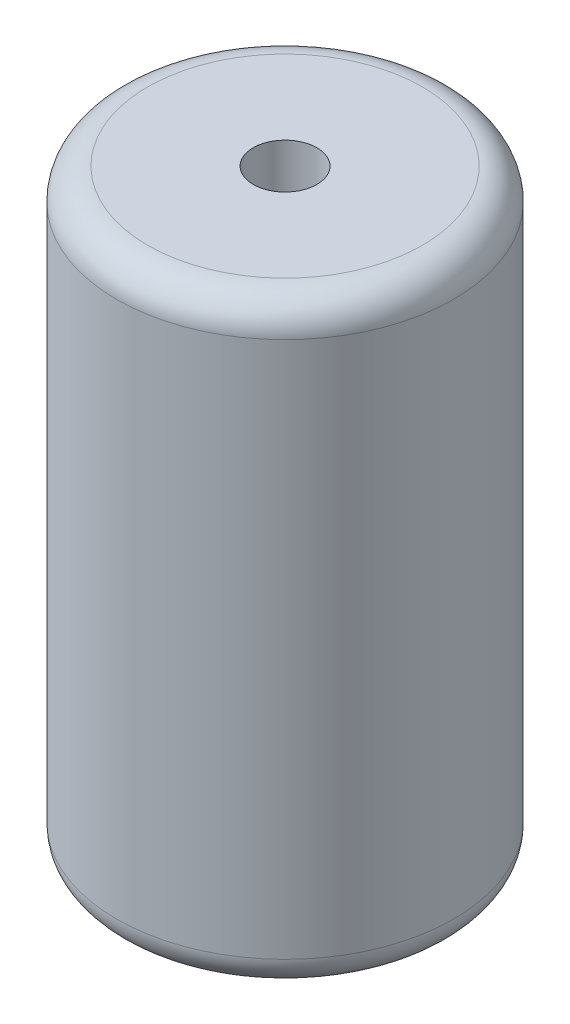
ISO-10303-21;
HEADER;
FILE_DESCRIPTION(('STEP AP214'),'2;1');
FILE_NAME('part.step','',(''),(''),'','','');
FILE_SCHEMA(('AUTOMOTIVE_DESIGN { 1 0 10303 214 1 1 1 1 }'));
ENDSEC;
DATA;
#1=APPLICATION_CONTEXT('core data for automotive mechanical design processes');
#2=APPLICATION_PROTOCOL_DEFINITION('international standard','automotive_design',2000,#1);
#3=PRODUCT_CONTEXT('',#1,'mechanical');
#4=PRODUCT('Part','Part','',(#3));
#5=PRODUCT_RELATED_PRODUCT_CATEGORY('part','',(#4));
#6=PRODUCT_DEFINITION_FORMATION('','',#4);
#7=PRODUCT_DEFINITION_CONTEXT('part definition',#1,'design');
#8=PRODUCT_DEFINITION('design','',#6,#7);
#9=PRODUCT_DEFINITION_SHAPE('','',#8);
#10=(LENGTH_UNIT() NAMED_UNIT(*) SI_UNIT(.MILLI.,.METRE.));
#11=(NAMED_UNIT(*) PLANE_ANGLE_UNIT() SI_UNIT($,.RADIAN.));
#12=(NAMED_UNIT(*) SI_UNIT($,.STERADIAN.) SOLID_ANGLE_UNIT());
#13=UNCERTAINTY_MEASURE_WITH_UNIT(LENGTH_MEASURE(1.E-05),#10,'distance_accuracy_value','');
#14=(GEOMETRIC_REPRESENTATION_CONTEXT(3) GLOBAL_UNCERTAINTY_ASSIGNED_CONTEXT((#13)) GLOBAL_UNIT_ASSIGNED_CONTEXT((#10,
#11,#12)) REPRESENTATION_CONTEXT('',''));
#15=CARTESIAN_POINT('',(0.,0.,0.));
#16=DIRECTION('',(0.,0.,1.));
#17=DIRECTION('',(1.,0.,0.));
#18=AXIS2_PLACEMENT_3D('',#15,#16,#17);
#19=CARTESIAN_POINT('',(0.,96.,0.));
#20=DIRECTION('',(0.,1.,0.));
#21=DIRECTION('',(0.,0.,1.));
#22=AXIS2_PLACEMENT_3D('',#19,#20,#21);
#23=PLANE('',#22);
#24=CARTESIAN_POINT('',(0.,96.,0.));
#25=DIRECTION('',(0.,1.,0.));
#26=DIRECTION('',(0.,0.,1.));
#27=AXIS2_PLACEMENT_3D('',#24,#25,#26);
#28=CIRCLE('',#27,22.);
#29=CARTESIAN_POINT('',(0.,96.,22.));
#30=VERTEX_POINT('',#29);
#31=EDGE_CURVE('E58',#30,#30,#28,.T.);
#32=ORIENTED_EDGE('',*,*,#31,.T.);
#33=EDGE_LOOP('',(#32));
#34=FACE_BOUND('',#33,.T.);
#35=CARTESIAN_POINT('',(0.,96.,0.));
#36=DIRECTION('',(0.,1.,0.));
#37=DIRECTION('',(0.,0.,1.));
#38=AXIS2_PLACEMENT_3D('',#35,#36,#37);
#39=CIRCLE('',#38,5.1);
#40=CARTESIAN_POINT('',(0.,96.,5.1));
#41=VERTEX_POINT('',#40);
#42=EDGE_CURVE('E63',#41,#41,#39,.T.);
#43=ORIENTED_EDGE('',*,*,#42,.F.);
#44=EDGE_LOOP('',(#43));
#45=FACE_BOUND('',#44,.T.);
#46=ADVANCED_FACE('F43',(#34,#45),#23,.T.);
#47=CARTESIAN_POINT('',(0.,0.,0.));
#48=DIRECTION('',(0.,1.,0.));
#49=DIRECTION('',(0.,0.,1.));
#50=AXIS2_PLACEMENT_3D('',#47,#48,#49);
#51=PLANE('',#50);
#52=CARTESIAN_POINT('',(0.,0.,0.));
#53=DIRECTION('',(0.,1.,0.));
#54=DIRECTION('',(0.,0.,1.));
#55=AXIS2_PLACEMENT_3D('',#52,#53,#54);
#56=CIRCLE('',#55,22.);
#57=CARTESIAN_POINT('',(0.,0.,22.));
#58=VERTEX_POINT('',#57);
#59=EDGE_CURVE('E10',#58,#58,#56,.F.);
#60=ORIENTED_EDGE('',*,*,#59,.T.);
#61=EDGE_LOOP('',(#60));
#62=FACE_BOUND('',#61,.T.);
#63=CARTESIAN_POINT('',(0.,0.,0.));
#64=DIRECTION('',(0.,1.,0.));
#65=DIRECTION('',(0.,0.,1.));
#66=AXIS2_PLACEMENT_3D('',#63,#64,#65);
#67=CIRCLE('',#66,5.1);
#68=CARTESIAN_POINT('',(0.,0.,5.1));
#69=VERTEX_POINT('',#68);
#70=EDGE_CURVE('E64',#69,#69,#67,.T.);
#71=ORIENTED_EDGE('',*,*,#70,.T.);
#72=EDGE_LOOP('',(#71));
#73=FACE_BOUND('',#72,.T.);
#74=ADVANCED_FACE('F74',(#62,#73),#51,.F.);
#75=CARTESIAN_POINT('',(0.,96.,0.));
#76=DIRECTION('',(0.,-1.,0.));
#77=DIRECTION('',(0.,0.,-1.));
#78=AXIS2_PLACEMENT_3D('',#75,#76,#77);
#79=CYLINDRICAL_SURFACE('',#78,27.);
#80=CARTESIAN_POINT('',(0.,91.,0.));
#81=DIRECTION('',(0.,1.,0.));
#82=DIRECTION('',(0.,0.,1.));
#83=AXIS2_PLACEMENT_3D('',#80,#81,#82);
#84=CIRCLE('',#83,27.);
#85=CARTESIAN_POINT('',(0.,91.,27.));
#86=VERTEX_POINT('',#85);
#87=EDGE_CURVE('E50',#86,#86,#84,.F.);
#88=ORIENTED_EDGE('',*,*,#87,.T.);
#89=EDGE_LOOP('',(#88));
#90=FACE_BOUND('',#89,.T.);
#91=CARTESIAN_POINT('',(0.,5.,0.));
#92=DIRECTION('',(0.,1.,0.));
#93=DIRECTION('',(0.,0.,1.));
#94=AXIS2_PLACEMENT_3D('',#91,#92,#93);
#95=CIRCLE('',#94,27.);
#96=CARTESIAN_POINT('',(0.,5.,27.));
#97=VERTEX_POINT('',#96);
#98=EDGE_CURVE('E54',#97,#97,#95,.T.);
#99=ORIENTED_EDGE('',*,*,#98,.T.);
#100=EDGE_LOOP('',(#99));
#101=FACE_BOUND('',#100,.T.);
#102=ADVANCED_FACE('F80',(#90,#101),#79,.T.);
#103=CARTESIAN_POINT('',(0.,96.,0.));
#104=DIRECTION('',(0.,-1.,0.));
#105=DIRECTION('',(0.,0.,-1.));
#106=AXIS2_PLACEMENT_3D('',#103,#104,#105);
#107=CYLINDRICAL_SURFACE('',#106,5.1);
#108=ORIENTED_EDGE('',*,*,#42,.T.);
#109=EDGE_LOOP('',(#108));
#110=FACE_BOUND('',#109,.T.);
#111=ORIENTED_EDGE('',*,*,#70,.F.);
#112=EDGE_LOOP('',(#111));
#113=FACE_BOUND('',#112,.T.);
#114=ADVANCED_FACE('F70',(#110,#113),#107,.F.);
#115=CARTESIAN_POINT('',(0.,91.,0.));
#116=DIRECTION('',(0.,1.,0.));
#117=DIRECTION('',(0.,0.,1.));
#118=AXIS2_PLACEMENT_3D('',#115,#116,#117);
#119=TOROIDAL_SURFACE('',#118,22.,5.);
#120=ORIENTED_EDGE('',*,*,#87,.F.);
#121=EDGE_LOOP('',(#120));
#122=FACE_BOUND('',#121,.T.);
#123=ORIENTED_EDGE('',*,*,#31,.F.);
#124=EDGE_LOOP('',(#123));
#125=FACE_BOUND('',#124,.T.);
#126=ADVANCED_FACE('F85',(#122,#125),#119,.T.);
#127=CARTESIAN_POINT('',(0.,5.,0.));
#128=DIRECTION('',(0.,1.,0.));
#129=DIRECTION('',(0.,0.,1.));
#130=AXIS2_PLACEMENT_3D('',#127,#128,#129);
#131=TOROIDAL_SURFACE('',#130,22.,5.);
#132=ORIENTED_EDGE('',*,*,#59,.F.);
#133=EDGE_LOOP('',(#132));
#134=FACE_BOUND('',#133,.T.);
#135=ORIENTED_EDGE('',*,*,#98,.F.);
#136=EDGE_LOOP('',(#135));
#137=FACE_BOUND('',#136,.T.);
#138=ADVANCED_FACE('F45',(#134,#137),#131,.T.);
#139=CLOSED_SHELL('',(#46,#74,#102,#114,#126,#138));
#140=MANIFOLD_SOLID_BREP('B2',#139);
#141=ADVANCED_BREP_SHAPE_REPRESENTATION('',(#18,#140),#14);
#142=SHAPE_DEFINITION_REPRESENTATION(#9,#141);
ENDSEC;
END-ISO-10303-21;
